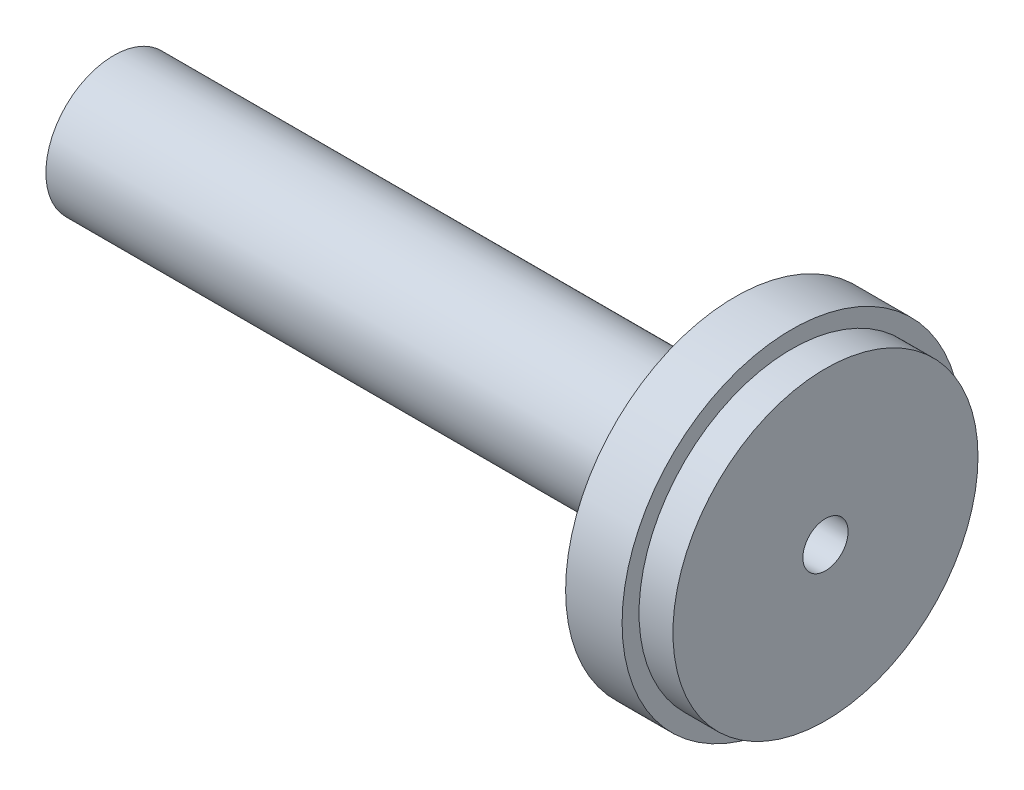
ISO-10303-21;
HEADER;
FILE_DESCRIPTION(('STEP AP214'),'2;1');
FILE_NAME('part.step','',(''),(''),'','','');
FILE_SCHEMA(('AUTOMOTIVE_DESIGN { 1 0 10303 214 1 1 1 1 }'));
ENDSEC;
DATA;
#1=APPLICATION_CONTEXT('core data for automotive mechanical design processes');
#2=APPLICATION_PROTOCOL_DEFINITION('international standard','automotive_design',2000,#1);
#3=PRODUCT_CONTEXT('',#1,'mechanical');
#4=PRODUCT('Part','Part','',(#3));
#5=PRODUCT_RELATED_PRODUCT_CATEGORY('part','',(#4));
#6=PRODUCT_DEFINITION_FORMATION('','',#4);
#7=PRODUCT_DEFINITION_CONTEXT('part definition',#1,'design');
#8=PRODUCT_DEFINITION('design','',#6,#7);
#9=PRODUCT_DEFINITION_SHAPE('','',#8);
#10=(LENGTH_UNIT() NAMED_UNIT(*) SI_UNIT(.MILLI.,.METRE.));
#11=(NAMED_UNIT(*) PLANE_ANGLE_UNIT() SI_UNIT($,.RADIAN.));
#12=(NAMED_UNIT(*) SI_UNIT($,.STERADIAN.) SOLID_ANGLE_UNIT());
#13=UNCERTAINTY_MEASURE_WITH_UNIT(LENGTH_MEASURE(1.E-05),#10,'distance_accuracy_value','');
#14=(GEOMETRIC_REPRESENTATION_CONTEXT(3) GLOBAL_UNCERTAINTY_ASSIGNED_CONTEXT((#13)) GLOBAL_UNIT_ASSIGNED_CONTEXT((#10,
#11,#12)) REPRESENTATION_CONTEXT('',''));
#15=CARTESIAN_POINT('',(0.,0.,0.));
#16=DIRECTION('',(0.,0.,1.));
#17=DIRECTION('',(1.,0.,0.));
#18=AXIS2_PLACEMENT_3D('',#15,#16,#17);
#19=CARTESIAN_POINT('',(1.8877394052198,-4.,0.));
#20=DIRECTION('',(-1.,0.,0.));
#21=DIRECTION('',(0.,0.,1.));
#22=AXIS2_PLACEMENT_3D('',#19,#20,#21);
#23=CONICAL_SURFACE('',#22,2.,0.0317353735284579);
#24=CARTESIAN_POINT('',(-61.1122605947802,-4.,0.));
#25=DIRECTION('',(1.,0.,0.));
#26=DIRECTION('',(0.,0.,-1.));
#27=AXIS2_PLACEMENT_3D('',#24,#25,#26);
#28=CIRCLE('',#27,4.);
#29=CARTESIAN_POINT('',(-61.1122605947802,-4.,-4.));
#30=VERTEX_POINT('',#29);
#31=EDGE_CURVE('E61',#30,#30,#28,.T.);
#32=ORIENTED_EDGE('',*,*,#31,.F.);
#33=EDGE_LOOP('',(#32));
#34=FACE_BOUND('',#33,.T.);
#35=CARTESIAN_POINT('',(1.8877394052198,-4.,0.));
#36=DIRECTION('',(1.,0.,0.));
#37=DIRECTION('',(0.,0.,-1.));
#38=AXIS2_PLACEMENT_3D('',#35,#36,#37);
#39=CIRCLE('',#38,2.);
#40=CARTESIAN_POINT('',(1.8877394052198,-4.,-2.));
#41=VERTEX_POINT('',#40);
#42=EDGE_CURVE('E10',#41,#41,#39,.T.);
#43=ORIENTED_EDGE('',*,*,#42,.T.);
#44=EDGE_LOOP('',(#43));
#45=FACE_BOUND('',#44,.T.);
#46=ADVANCED_FACE('F33',(#34,#45),#23,.F.);
#47=CARTESIAN_POINT('',(1.8877394052198,0.,0.));
#48=DIRECTION('',(-1.,0.,0.));
#49=DIRECTION('',(0.,0.,1.));
#50=AXIS2_PLACEMENT_3D('',#47,#48,#49);
#51=PLANE('',#50);
#52=ORIENTED_EDGE('',*,*,#42,.F.);
#53=EDGE_LOOP('',(#52));
#54=FACE_BOUND('',#53,.T.);
#55=CARTESIAN_POINT('',(1.8877394052198,-4.,0.));
#56=DIRECTION('',(1.,0.,0.));
#57=DIRECTION('',(0.,0.,-1.));
#58=AXIS2_PLACEMENT_3D('',#55,#56,#57);
#59=CIRCLE('',#58,13.5);
#60=CARTESIAN_POINT('',(1.8877394052198,-4.,-13.5));
#61=VERTEX_POINT('',#60);
#62=EDGE_CURVE('E39',#61,#61,#59,.T.);
#63=ORIENTED_EDGE('',*,*,#62,.T.);
#64=EDGE_LOOP('',(#63));
#65=FACE_BOUND('',#64,.T.);
#66=ADVANCED_FACE('F68',(#54,#65),#51,.F.);
#67=CARTESIAN_POINT('',(1.8877394052198,-4.,0.));
#68=DIRECTION('',(1.,0.,0.));
#69=DIRECTION('',(0.,0.,-1.));
#70=AXIS2_PLACEMENT_3D('',#67,#68,#69);
#71=CYLINDRICAL_SURFACE('',#70,13.5);
#72=ORIENTED_EDGE('',*,*,#62,.F.);
#73=EDGE_LOOP('',(#72));
#74=FACE_BOUND('',#73,.T.);
#75=CARTESIAN_POINT('',(-1.1122605947802,-4.,0.));
#76=DIRECTION('',(1.,0.,0.));
#77=DIRECTION('',(0.,0.,-1.));
#78=AXIS2_PLACEMENT_3D('',#75,#76,#77);
#79=CIRCLE('',#78,13.5);
#80=CARTESIAN_POINT('',(-1.1122605947802,-4.,-13.5));
#81=VERTEX_POINT('',#80);
#82=EDGE_CURVE('E43',#81,#81,#79,.T.);
#83=ORIENTED_EDGE('',*,*,#82,.T.);
#84=EDGE_LOOP('',(#83));
#85=FACE_BOUND('',#84,.T.);
#86=ADVANCED_FACE('F72',(#74,#85),#71,.T.);
#87=CARTESIAN_POINT('',(-1.1122605947802,0.,0.));
#88=DIRECTION('',(-1.,0.,0.));
#89=DIRECTION('',(0.,0.,1.));
#90=AXIS2_PLACEMENT_3D('',#87,#88,#89);
#91=PLANE('',#90);
#92=ORIENTED_EDGE('',*,*,#82,.F.);
#93=EDGE_LOOP('',(#92));
#94=FACE_BOUND('',#93,.T.);
#95=CARTESIAN_POINT('',(-1.1122605947802,-4.,0.));
#96=DIRECTION('',(1.,0.,0.));
#97=DIRECTION('',(0.,0.,-1.));
#98=AXIS2_PLACEMENT_3D('',#95,#96,#97);
#99=CIRCLE('',#98,15.);
#100=CARTESIAN_POINT('',(-1.1122605947802,-4.,-15.));
#101=VERTEX_POINT('',#100);
#102=EDGE_CURVE('E47',#101,#101,#99,.T.);
#103=ORIENTED_EDGE('',*,*,#102,.T.);
#104=EDGE_LOOP('',(#103));
#105=FACE_BOUND('',#104,.T.);
#106=ADVANCED_FACE('F77',(#94,#105),#91,.F.);
#107=CARTESIAN_POINT('',(1.8877394052198,-4.,0.));
#108=DIRECTION('',(1.,0.,0.));
#109=DIRECTION('',(0.,0.,-1.));
#110=AXIS2_PLACEMENT_3D('',#107,#108,#109);
#111=CYLINDRICAL_SURFACE('',#110,15.);
#112=ORIENTED_EDGE('',*,*,#102,.F.);
#113=EDGE_LOOP('',(#112));
#114=FACE_BOUND('',#113,.T.);
#115=CARTESIAN_POINT('',(-6.1122605947802,-4.,0.));
#116=DIRECTION('',(1.,0.,0.));
#117=DIRECTION('',(0.,0.,-1.));
#118=AXIS2_PLACEMENT_3D('',#115,#116,#117);
#119=CIRCLE('',#118,15.);
#120=CARTESIAN_POINT('',(-6.1122605947802,-4.,-15.));
#121=VERTEX_POINT('',#120);
#122=EDGE_CURVE('E52',#121,#121,#119,.T.);
#123=ORIENTED_EDGE('',*,*,#122,.T.);
#124=EDGE_LOOP('',(#123));
#125=FACE_BOUND('',#124,.T.);
#126=ADVANCED_FACE('F83',(#114,#125),#111,.T.);
#127=CARTESIAN_POINT('',(-6.1122605947802,0.,0.));
#128=DIRECTION('',(1.,0.,0.));
#129=DIRECTION('',(0.,0.,-1.));
#130=AXIS2_PLACEMENT_3D('',#127,#128,#129);
#131=PLANE('',#130);
#132=ORIENTED_EDGE('',*,*,#122,.F.);
#133=EDGE_LOOP('',(#132));
#134=FACE_BOUND('',#133,.T.);
#135=CARTESIAN_POINT('',(-6.1122605947802,-4.,0.));
#136=DIRECTION('',(1.,0.,0.));
#137=DIRECTION('',(0.,0.,-1.));
#138=AXIS2_PLACEMENT_3D('',#135,#136,#137);
#139=CIRCLE('',#138,6.);
#140=CARTESIAN_POINT('',(-6.1122605947802,-4.,-6.));
#141=VERTEX_POINT('',#140);
#142=EDGE_CURVE('E55',#141,#141,#139,.T.);
#143=ORIENTED_EDGE('',*,*,#142,.T.);
#144=EDGE_LOOP('',(#143));
#145=FACE_BOUND('',#144,.T.);
#146=ADVANCED_FACE('F87',(#134,#145),#131,.F.);
#147=CARTESIAN_POINT('',(1.8877394052198,-4.,0.));
#148=DIRECTION('',(1.,0.,0.));
#149=DIRECTION('',(0.,0.,-1.));
#150=AXIS2_PLACEMENT_3D('',#147,#148,#149);
#151=CYLINDRICAL_SURFACE('',#150,6.);
#152=ORIENTED_EDGE('',*,*,#142,.F.);
#153=EDGE_LOOP('',(#152));
#154=FACE_BOUND('',#153,.T.);
#155=CARTESIAN_POINT('',(-61.1122605947802,-4.,0.));
#156=DIRECTION('',(1.,0.,0.));
#157=DIRECTION('',(0.,0.,-1.));
#158=AXIS2_PLACEMENT_3D('',#155,#156,#157);
#159=CIRCLE('',#158,6.);
#160=CARTESIAN_POINT('',(-61.1122605947802,-4.,-6.));
#161=VERTEX_POINT('',#160);
#162=EDGE_CURVE('E58',#161,#161,#159,.T.);
#163=ORIENTED_EDGE('',*,*,#162,.T.);
#164=EDGE_LOOP('',(#163));
#165=FACE_BOUND('',#164,.T.);
#166=ADVANCED_FACE('F91',(#154,#165),#151,.T.);
#167=CARTESIAN_POINT('',(-61.1122605947802,0.,0.));
#168=DIRECTION('',(1.,0.,0.));
#169=DIRECTION('',(0.,0.,-1.));
#170=AXIS2_PLACEMENT_3D('',#167,#168,#169);
#171=PLANE('',#170);
#172=ORIENTED_EDGE('',*,*,#162,.F.);
#173=EDGE_LOOP('',(#172));
#174=FACE_BOUND('',#173,.T.);
#175=ORIENTED_EDGE('',*,*,#31,.T.);
#176=EDGE_LOOP('',(#175));
#177=FACE_BOUND('',#176,.T.);
#178=ADVANCED_FACE('F65',(#174,#177),#171,.F.);
#179=CLOSED_SHELL('',(#46,#66,#86,#106,#126,#146,#166,#178));
#180=MANIFOLD_SOLID_BREP('B2',#179);
#181=ADVANCED_BREP_SHAPE_REPRESENTATION('',(#18,#180),#14);
#182=SHAPE_DEFINITION_REPRESENTATION(#9,#181);
ENDSEC;
END-ISO-10303-21;
